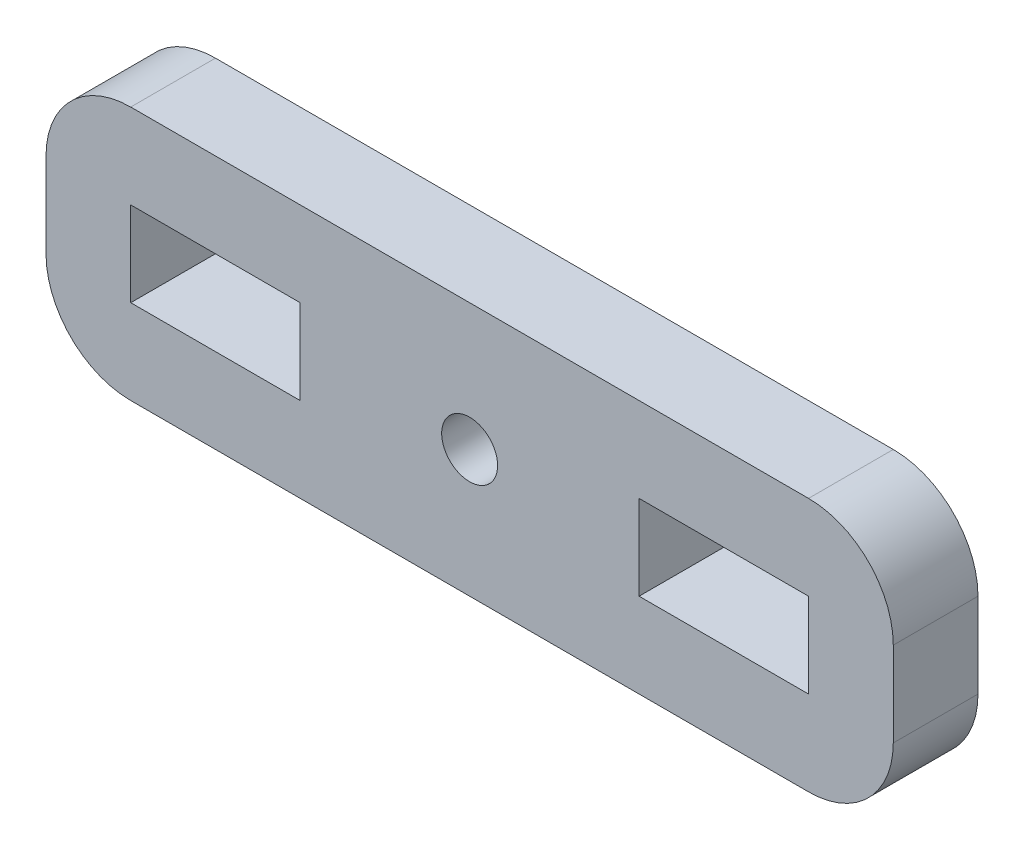
ISO-10303-21;
HEADER;
FILE_DESCRIPTION(('STEP AP214'),'2;1');
FILE_NAME('part.step','',(''),(''),'','','');
FILE_SCHEMA(('AUTOMOTIVE_DESIGN { 1 0 10303 214 1 1 1 1 }'));
ENDSEC;
DATA;
#1=APPLICATION_CONTEXT('core data for automotive mechanical design processes');
#2=APPLICATION_PROTOCOL_DEFINITION('international standard','automotive_design',2000,#1);
#3=PRODUCT_CONTEXT('',#1,'mechanical');
#4=PRODUCT('Part','Part','',(#3));
#5=PRODUCT_RELATED_PRODUCT_CATEGORY('part','',(#4));
#6=PRODUCT_DEFINITION_FORMATION('','',#4);
#7=PRODUCT_DEFINITION_CONTEXT('part definition',#1,'design');
#8=PRODUCT_DEFINITION('design','',#6,#7);
#9=PRODUCT_DEFINITION_SHAPE('','',#8);
#10=(LENGTH_UNIT() NAMED_UNIT(*) SI_UNIT(.MILLI.,.METRE.));
#11=(NAMED_UNIT(*) PLANE_ANGLE_UNIT() SI_UNIT($,.RADIAN.));
#12=(NAMED_UNIT(*) SI_UNIT($,.STERADIAN.) SOLID_ANGLE_UNIT());
#13=UNCERTAINTY_MEASURE_WITH_UNIT(LENGTH_MEASURE(1.E-05),#10,'distance_accuracy_value','');
#14=(GEOMETRIC_REPRESENTATION_CONTEXT(3) GLOBAL_UNCERTAINTY_ASSIGNED_CONTEXT((#13)) GLOBAL_UNIT_ASSIGNED_CONTEXT((#10,
#11,#12)) REPRESENTATION_CONTEXT('',''));
#15=CARTESIAN_POINT('',(0.,0.,0.));
#16=DIRECTION('',(0.,0.,1.));
#17=DIRECTION('',(1.,0.,0.));
#18=AXIS2_PLACEMENT_3D('',#15,#16,#17);
#19=CARTESIAN_POINT('',(31.75,-9.525,6.35));
#20=DIRECTION('',(-1.,0.,0.));
#21=DIRECTION('',(0.,0.,1.));
#22=AXIS2_PLACEMENT_3D('',#19,#20,#21);
#23=PLANE('',#22);
#24=DIRECTION('',(0.,1.,0.));
#25=VECTOR('',#24,1.);
#26=CARTESIAN_POINT('',(31.75,-9.525,0.));
#27=LINE('',#26,#25);
#28=CARTESIAN_POINT('',(31.75,-3.175,0.));
#29=VERTEX_POINT('',#28);
#30=CARTESIAN_POINT('',(31.75,3.175,0.));
#31=VERTEX_POINT('',#30);
#32=EDGE_CURVE('E225',#29,#31,#27,.T.);
#33=ORIENTED_EDGE('',*,*,#32,.T.);
#34=DIRECTION('',(0.,0.,-1.));
#35=VECTOR('',#34,1.);
#36=CARTESIAN_POINT('',(31.75,3.175,6.35));
#37=LINE('',#36,#35);
#38=CARTESIAN_POINT('',(31.75,3.175,6.35));
#39=VERTEX_POINT('',#38);
#40=EDGE_CURVE('E264',#31,#39,#37,.F.);
#41=ORIENTED_EDGE('',*,*,#40,.T.);
#42=DIRECTION('',(0.,1.,0.));
#43=VECTOR('',#42,1.);
#44=CARTESIAN_POINT('',(31.75,-9.525,6.35));
#45=LINE('',#44,#43);
#46=CARTESIAN_POINT('',(31.75,-3.175,6.35));
#47=VERTEX_POINT('',#46);
#48=EDGE_CURVE('E228',#47,#39,#45,.T.);
#49=ORIENTED_EDGE('',*,*,#48,.F.);
#50=DIRECTION('',(0.,0.,-1.));
#51=VECTOR('',#50,1.);
#52=CARTESIAN_POINT('',(31.75,-3.175,6.35));
#53=LINE('',#52,#51);
#54=EDGE_CURVE('E261',#47,#29,#53,.T.);
#55=ORIENTED_EDGE('',*,*,#54,.T.);
#56=EDGE_LOOP('',(#33,#41,#49,#55));
#57=FACE_BOUND('',#56,.T.);
#58=ADVANCED_FACE('F32',(#57),#23,.F.);
#59=CARTESIAN_POINT('',(-31.75,9.525,6.35));
#60=DIRECTION('',(0.,-1.,0.));
#61=DIRECTION('',(0.,0.,-1.));
#62=AXIS2_PLACEMENT_3D('',#59,#60,#61);
#63=PLANE('',#62);
#64=DIRECTION('',(-1.,0.,0.));
#65=VECTOR('',#64,1.);
#66=CARTESIAN_POINT('',(-31.75,9.525,6.35));
#67=LINE('',#66,#65);
#68=CARTESIAN_POINT('',(25.4,9.525,6.35));
#69=VERTEX_POINT('',#68);
#70=CARTESIAN_POINT('',(-25.4,9.525,6.35));
#71=VERTEX_POINT('',#70);
#72=EDGE_CURVE('E231',#69,#71,#67,.T.);
#73=ORIENTED_EDGE('',*,*,#72,.F.);
#74=DIRECTION('',(0.,0.,-1.));
#75=VECTOR('',#74,1.);
#76=CARTESIAN_POINT('',(25.4,9.525,6.35));
#77=LINE('',#76,#75);
#78=CARTESIAN_POINT('',(25.4,9.525,0.));
#79=VERTEX_POINT('',#78);
#80=EDGE_CURVE('E250',#69,#79,#77,.T.);
#81=ORIENTED_EDGE('',*,*,#80,.T.);
#82=DIRECTION('',(-1.,0.,0.));
#83=VECTOR('',#82,1.);
#84=CARTESIAN_POINT('',(-31.75,9.525,0.));
#85=LINE('',#84,#83);
#86=CARTESIAN_POINT('',(-25.4,9.525,0.));
#87=VERTEX_POINT('',#86);
#88=EDGE_CURVE('E242',#79,#87,#85,.T.);
#89=ORIENTED_EDGE('',*,*,#88,.T.);
#90=DIRECTION('',(0.,0.,-1.));
#91=VECTOR('',#90,1.);
#92=CARTESIAN_POINT('',(-25.4,9.525,6.35));
#93=LINE('',#92,#91);
#94=EDGE_CURVE('E239',#87,#71,#93,.F.);
#95=ORIENTED_EDGE('',*,*,#94,.T.);
#96=EDGE_LOOP('',(#73,#81,#89,#95));
#97=FACE_BOUND('',#96,.T.);
#98=ADVANCED_FACE('F306',(#97),#63,.F.);
#99=CARTESIAN_POINT('',(-31.75,-9.525,6.35));
#100=DIRECTION('',(1.,0.,0.));
#101=DIRECTION('',(0.,0.,-1.));
#102=AXIS2_PLACEMENT_3D('',#99,#100,#101);
#103=PLANE('',#102);
#104=DIRECTION('',(0.,-1.,0.));
#105=VECTOR('',#104,1.);
#106=CARTESIAN_POINT('',(-31.75,-9.525,6.35));
#107=LINE('',#106,#105);
#108=CARTESIAN_POINT('',(-31.75,3.175,6.35));
#109=VERTEX_POINT('',#108);
#110=CARTESIAN_POINT('',(-31.75,-3.175,6.35));
#111=VERTEX_POINT('',#110);
#112=EDGE_CURVE('E235',#109,#111,#107,.T.);
#113=ORIENTED_EDGE('',*,*,#112,.F.);
#114=DIRECTION('',(0.,0.,-1.));
#115=VECTOR('',#114,1.);
#116=CARTESIAN_POINT('',(-31.75,3.175,6.35));
#117=LINE('',#116,#115);
#118=CARTESIAN_POINT('',(-31.75,3.175,0.));
#119=VERTEX_POINT('',#118);
#120=EDGE_CURVE('E275',#109,#119,#117,.T.);
#121=ORIENTED_EDGE('',*,*,#120,.T.);
#122=DIRECTION('',(0.,-1.,0.));
#123=VECTOR('',#122,1.);
#124=CARTESIAN_POINT('',(-31.75,-9.525,0.));
#125=LINE('',#124,#123);
#126=CARTESIAN_POINT('',(-31.75,-3.175,0.));
#127=VERTEX_POINT('',#126);
#128=EDGE_CURVE('E245',#119,#127,#125,.T.);
#129=ORIENTED_EDGE('',*,*,#128,.T.);
#130=DIRECTION('',(0.,0.,-1.));
#131=VECTOR('',#130,1.);
#132=CARTESIAN_POINT('',(-31.75,-3.175,6.35));
#133=LINE('',#132,#131);
#134=EDGE_CURVE('E273',#127,#111,#133,.F.);
#135=ORIENTED_EDGE('',*,*,#134,.T.);
#136=EDGE_LOOP('',(#113,#121,#129,#135));
#137=FACE_BOUND('',#136,.T.);
#138=ADVANCED_FACE('F281',(#137),#103,.F.);
#139=CARTESIAN_POINT('',(-31.75,-9.525,6.35));
#140=DIRECTION('',(0.,1.,0.));
#141=DIRECTION('',(0.,0.,1.));
#142=AXIS2_PLACEMENT_3D('',#139,#140,#141);
#143=PLANE('',#142);
#144=DIRECTION('',(1.,0.,0.));
#145=VECTOR('',#144,1.);
#146=CARTESIAN_POINT('',(-31.75,-9.525,6.35));
#147=LINE('',#146,#145);
#148=CARTESIAN_POINT('',(-25.4,-9.525,6.35));
#149=VERTEX_POINT('',#148);
#150=CARTESIAN_POINT('',(25.4,-9.525,6.35));
#151=VERTEX_POINT('',#150);
#152=EDGE_CURVE('E237',#149,#151,#147,.T.);
#153=ORIENTED_EDGE('',*,*,#152,.F.);
#154=DIRECTION('',(0.,0.,-1.));
#155=VECTOR('',#154,1.);
#156=CARTESIAN_POINT('',(-25.4,-9.525,6.35));
#157=LINE('',#156,#155);
#158=CARTESIAN_POINT('',(-25.4,-9.525,0.));
#159=VERTEX_POINT('',#158);
#160=EDGE_CURVE('E11',#149,#159,#157,.T.);
#161=ORIENTED_EDGE('',*,*,#160,.T.);
#162=DIRECTION('',(1.,0.,0.));
#163=VECTOR('',#162,1.);
#164=CARTESIAN_POINT('',(-31.75,-9.525,0.));
#165=LINE('',#164,#163);
#166=CARTESIAN_POINT('',(25.4,-9.525,0.));
#167=VERTEX_POINT('',#166);
#168=EDGE_CURVE('E232',#159,#167,#165,.T.);
#169=ORIENTED_EDGE('',*,*,#168,.T.);
#170=DIRECTION('',(0.,0.,-1.));
#171=VECTOR('',#170,1.);
#172=CARTESIAN_POINT('',(25.4,-9.525,6.35));
#173=LINE('',#172,#171);
#174=EDGE_CURVE('E40',#167,#151,#173,.F.);
#175=ORIENTED_EDGE('',*,*,#174,.T.);
#176=EDGE_LOOP('',(#153,#161,#169,#175));
#177=FACE_BOUND('',#176,.T.);
#178=ADVANCED_FACE('F291',(#177),#143,.F.);
#179=CARTESIAN_POINT('',(0.,0.,6.35));
#180=DIRECTION('',(0.,0.,-1.));
#181=DIRECTION('',(-1.,0.,0.));
#182=AXIS2_PLACEMENT_3D('',#179,#180,#181);
#183=PLANE('',#182);
#184=DIRECTION('',(1.,0.,0.));
#185=VECTOR('',#184,1.);
#186=CARTESIAN_POINT('',(12.7,-3.175,6.35));
#187=LINE('',#186,#185);
#188=CARTESIAN_POINT('',(12.7,-3.175,6.35));
#189=VERTEX_POINT('',#188);
#190=CARTESIAN_POINT('',(25.4,-3.175,6.35));
#191=VERTEX_POINT('',#190);
#192=EDGE_CURVE('E180',#189,#191,#187,.T.);
#193=ORIENTED_EDGE('',*,*,#192,.F.);
#194=DIRECTION('',(0.,-1.,0.));
#195=VECTOR('',#194,1.);
#196=CARTESIAN_POINT('',(12.7,3.175,6.35));
#197=LINE('',#196,#195);
#198=CARTESIAN_POINT('',(12.7,3.175,6.35));
#199=VERTEX_POINT('',#198);
#200=EDGE_CURVE('E153',#199,#189,#197,.T.);
#201=ORIENTED_EDGE('',*,*,#200,.F.);
#202=DIRECTION('',(-1.,0.,0.));
#203=VECTOR('',#202,1.);
#204=CARTESIAN_POINT('',(12.7,3.175,6.35));
#205=LINE('',#204,#203);
#206=CARTESIAN_POINT('',(25.4,3.175,6.35));
#207=VERTEX_POINT('',#206);
#208=EDGE_CURVE('E171',#207,#199,#205,.T.);
#209=ORIENTED_EDGE('',*,*,#208,.F.);
#210=DIRECTION('',(0.,1.,0.));
#211=VECTOR('',#210,1.);
#212=CARTESIAN_POINT('',(25.4,3.175,6.35));
#213=LINE('',#212,#211);
#214=EDGE_CURVE('E174',#191,#207,#213,.T.);
#215=ORIENTED_EDGE('',*,*,#214,.F.);
#216=EDGE_LOOP('',(#193,#201,#209,#215));
#217=FACE_BOUND('',#216,.T.);
#218=DIRECTION('',(1.,0.,0.));
#219=VECTOR('',#218,1.);
#220=CARTESIAN_POINT('',(-25.4,-3.175,6.35));
#221=LINE('',#220,#219);
#222=CARTESIAN_POINT('',(-25.4,-3.175,6.35));
#223=VERTEX_POINT('',#222);
#224=CARTESIAN_POINT('',(-12.7,-3.175,6.35));
#225=VERTEX_POINT('',#224);
#226=EDGE_CURVE('E205',#223,#225,#221,.T.);
#227=ORIENTED_EDGE('',*,*,#226,.F.);
#228=DIRECTION('',(0.,-1.,0.));
#229=VECTOR('',#228,1.);
#230=CARTESIAN_POINT('',(-25.4,3.175,6.35));
#231=LINE('',#230,#229);
#232=CARTESIAN_POINT('',(-25.4,3.175,6.35));
#233=VERTEX_POINT('',#232);
#234=EDGE_CURVE('E186',#233,#223,#231,.T.);
#235=ORIENTED_EDGE('',*,*,#234,.F.);
#236=DIRECTION('',(-1.,0.,0.));
#237=VECTOR('',#236,1.);
#238=CARTESIAN_POINT('',(-25.4,3.175,6.35));
#239=LINE('',#238,#237);
#240=CARTESIAN_POINT('',(-12.7,3.175,6.35));
#241=VERTEX_POINT('',#240);
#242=EDGE_CURVE('E194',#241,#233,#239,.T.);
#243=ORIENTED_EDGE('',*,*,#242,.F.);
#244=DIRECTION('',(0.,1.,0.));
#245=VECTOR('',#244,1.);
#246=CARTESIAN_POINT('',(-12.7,3.175,6.35));
#247=LINE('',#246,#245);
#248=EDGE_CURVE('E208',#225,#241,#247,.T.);
#249=ORIENTED_EDGE('',*,*,#248,.F.);
#250=EDGE_LOOP('',(#227,#235,#243,#249));
#251=FACE_BOUND('',#250,.T.);
#252=CARTESIAN_POINT('',(0.,0.,6.35));
#253=DIRECTION('',(0.,0.,1.));
#254=DIRECTION('',(1.,0.,0.));
#255=AXIS2_PLACEMENT_3D('',#252,#253,#254);
#256=CIRCLE('',#255,2.0955);
#257=CARTESIAN_POINT('',(2.09550000000001,0.,6.35));
#258=VERTEX_POINT('',#257);
#259=EDGE_CURVE('E215',#258,#258,#256,.T.);
#260=ORIENTED_EDGE('',*,*,#259,.F.);
#261=EDGE_LOOP('',(#260));
#262=FACE_BOUND('',#261,.T.);
#263=ORIENTED_EDGE('',*,*,#48,.T.);
#264=CARTESIAN_POINT('',(25.4,3.175,6.35));
#265=DIRECTION('',(0.,0.,-1.));
#266=DIRECTION('',(-1.,0.,0.));
#267=AXIS2_PLACEMENT_3D('',#264,#265,#266);
#268=CIRCLE('',#267,6.35);
#269=EDGE_CURVE('E271',#39,#69,#268,.F.);
#270=ORIENTED_EDGE('',*,*,#269,.T.);
#271=ORIENTED_EDGE('',*,*,#72,.T.);
#272=CARTESIAN_POINT('',(-25.4,3.175,6.35));
#273=DIRECTION('',(0.,0.,-1.));
#274=DIRECTION('',(-1.,0.,0.));
#275=AXIS2_PLACEMENT_3D('',#272,#273,#274);
#276=CIRCLE('',#275,6.35);
#277=EDGE_CURVE('E269',#71,#109,#276,.F.);
#278=ORIENTED_EDGE('',*,*,#277,.T.);
#279=ORIENTED_EDGE('',*,*,#112,.T.);
#280=CARTESIAN_POINT('',(-25.4,-3.175,6.35));
#281=DIRECTION('',(0.,0.,-1.));
#282=DIRECTION('',(-1.,0.,0.));
#283=AXIS2_PLACEMENT_3D('',#280,#281,#282);
#284=CIRCLE('',#283,6.35);
#285=EDGE_CURVE('E53',#111,#149,#284,.F.);
#286=ORIENTED_EDGE('',*,*,#285,.T.);
#287=ORIENTED_EDGE('',*,*,#152,.T.);
#288=CARTESIAN_POINT('',(25.4,-3.175,6.35));
#289=DIRECTION('',(0.,0.,-1.));
#290=DIRECTION('',(-1.,0.,0.));
#291=AXIS2_PLACEMENT_3D('',#288,#289,#290);
#292=CIRCLE('',#291,6.35);
#293=EDGE_CURVE('E266',#151,#47,#292,.F.);
#294=ORIENTED_EDGE('',*,*,#293,.T.);
#295=EDGE_LOOP('',(#263,#270,#271,#278,#279,#286,#287,#294));
#296=FACE_BOUND('',#295,.T.);
#297=ADVANCED_FACE('F293',(#217,#251,#262,#296),#183,.F.);
#298=CARTESIAN_POINT('',(0.,0.,0.));
#299=DIRECTION('',(0.,0.,-1.));
#300=DIRECTION('',(-1.,0.,0.));
#301=AXIS2_PLACEMENT_3D('',#298,#299,#300);
#302=PLANE('',#301);
#303=DIRECTION('',(0.,-1.,0.));
#304=VECTOR('',#303,1.);
#305=CARTESIAN_POINT('',(12.7,3.175,0.));
#306=LINE('',#305,#304);
#307=CARTESIAN_POINT('',(12.7,3.175,0.));
#308=VERTEX_POINT('',#307);
#309=CARTESIAN_POINT('',(12.7,-3.175,0.));
#310=VERTEX_POINT('',#309);
#311=EDGE_CURVE('E150',#308,#310,#306,.T.);
#312=ORIENTED_EDGE('',*,*,#311,.T.);
#313=DIRECTION('',(1.,0.,0.));
#314=VECTOR('',#313,1.);
#315=CARTESIAN_POINT('',(12.7,-3.175,0.));
#316=LINE('',#315,#314);
#317=CARTESIAN_POINT('',(25.4,-3.175,0.));
#318=VERTEX_POINT('',#317);
#319=EDGE_CURVE('E162',#310,#318,#316,.T.);
#320=ORIENTED_EDGE('',*,*,#319,.T.);
#321=DIRECTION('',(0.,1.,0.));
#322=VECTOR('',#321,1.);
#323=CARTESIAN_POINT('',(25.4,3.175,0.));
#324=LINE('',#323,#322);
#325=CARTESIAN_POINT('',(25.4,3.175,0.));
#326=VERTEX_POINT('',#325);
#327=EDGE_CURVE('E166',#318,#326,#324,.T.);
#328=ORIENTED_EDGE('',*,*,#327,.T.);
#329=DIRECTION('',(-1.,0.,0.));
#330=VECTOR('',#329,1.);
#331=CARTESIAN_POINT('',(12.7,3.175,0.));
#332=LINE('',#331,#330);
#333=EDGE_CURVE('E158',#326,#308,#332,.T.);
#334=ORIENTED_EDGE('',*,*,#333,.T.);
#335=EDGE_LOOP('',(#312,#320,#328,#334));
#336=FACE_BOUND('',#335,.T.);
#337=DIRECTION('',(0.,-1.,0.));
#338=VECTOR('',#337,1.);
#339=CARTESIAN_POINT('',(-25.4,3.175,0.));
#340=LINE('',#339,#338);
#341=CARTESIAN_POINT('',(-25.4,3.175,0.));
#342=VERTEX_POINT('',#341);
#343=CARTESIAN_POINT('',(-25.4,-3.175,0.));
#344=VERTEX_POINT('',#343);
#345=EDGE_CURVE('E190',#342,#344,#340,.T.);
#346=ORIENTED_EDGE('',*,*,#345,.T.);
#347=DIRECTION('',(1.,0.,0.));
#348=VECTOR('',#347,1.);
#349=CARTESIAN_POINT('',(-25.4,-3.175,0.));
#350=LINE('',#349,#348);
#351=CARTESIAN_POINT('',(-12.7,-3.175,0.));
#352=VERTEX_POINT('',#351);
#353=EDGE_CURVE('E193',#344,#352,#350,.T.);
#354=ORIENTED_EDGE('',*,*,#353,.T.);
#355=DIRECTION('',(0.,1.,0.));
#356=VECTOR('',#355,1.);
#357=CARTESIAN_POINT('',(-12.7,3.175,0.));
#358=LINE('',#357,#356);
#359=CARTESIAN_POINT('',(-12.7,3.175,0.));
#360=VERTEX_POINT('',#359);
#361=EDGE_CURVE('E197',#352,#360,#358,.T.);
#362=ORIENTED_EDGE('',*,*,#361,.T.);
#363=DIRECTION('',(-1.,0.,0.));
#364=VECTOR('',#363,1.);
#365=CARTESIAN_POINT('',(-25.4,3.175,0.));
#366=LINE('',#365,#364);
#367=EDGE_CURVE('E200',#360,#342,#366,.T.);
#368=ORIENTED_EDGE('',*,*,#367,.T.);
#369=EDGE_LOOP('',(#346,#354,#362,#368));
#370=FACE_BOUND('',#369,.T.);
#371=CARTESIAN_POINT('',(0.,0.,0.));
#372=DIRECTION('',(0.,0.,1.));
#373=DIRECTION('',(1.,0.,0.));
#374=AXIS2_PLACEMENT_3D('',#371,#372,#373);
#375=CIRCLE('',#374,2.0955);
#376=CARTESIAN_POINT('',(2.09550000000001,0.,0.));
#377=VERTEX_POINT('',#376);
#378=EDGE_CURVE('E222',#377,#377,#375,.T.);
#379=ORIENTED_EDGE('',*,*,#378,.T.);
#380=EDGE_LOOP('',(#379));
#381=FACE_BOUND('',#380,.T.);
#382=ORIENTED_EDGE('',*,*,#88,.F.);
#383=CARTESIAN_POINT('',(25.4,3.175,0.));
#384=DIRECTION('',(0.,0.,-1.));
#385=DIRECTION('',(-1.,0.,0.));
#386=AXIS2_PLACEMENT_3D('',#383,#384,#385);
#387=CIRCLE('',#386,6.35);
#388=EDGE_CURVE('E259',#79,#31,#387,.T.);
#389=ORIENTED_EDGE('',*,*,#388,.T.);
#390=ORIENTED_EDGE('',*,*,#32,.F.);
#391=CARTESIAN_POINT('',(25.4,-3.175,0.));
#392=DIRECTION('',(0.,0.,-1.));
#393=DIRECTION('',(-1.,0.,0.));
#394=AXIS2_PLACEMENT_3D('',#391,#392,#393);
#395=CIRCLE('',#394,6.35);
#396=EDGE_CURVE('E253',#29,#167,#395,.T.);
#397=ORIENTED_EDGE('',*,*,#396,.T.);
#398=ORIENTED_EDGE('',*,*,#168,.F.);
#399=CARTESIAN_POINT('',(-25.4,-3.175,0.));
#400=DIRECTION('',(0.,0.,-1.));
#401=DIRECTION('',(-1.,0.,0.));
#402=AXIS2_PLACEMENT_3D('',#399,#400,#401);
#403=CIRCLE('',#402,6.35);
#404=EDGE_CURVE('E255',#159,#127,#403,.T.);
#405=ORIENTED_EDGE('',*,*,#404,.T.);
#406=ORIENTED_EDGE('',*,*,#128,.F.);
#407=CARTESIAN_POINT('',(-25.4,3.175,0.));
#408=DIRECTION('',(0.,0.,-1.));
#409=DIRECTION('',(-1.,0.,0.));
#410=AXIS2_PLACEMENT_3D('',#407,#408,#409);
#411=CIRCLE('',#410,6.35);
#412=EDGE_CURVE('E257',#119,#87,#411,.T.);
#413=ORIENTED_EDGE('',*,*,#412,.T.);
#414=EDGE_LOOP('',(#382,#389,#390,#397,#398,#405,#406,#413));
#415=FACE_BOUND('',#414,.T.);
#416=ADVANCED_FACE('F168',(#336,#370,#381,#415),#302,.T.);
#417=CARTESIAN_POINT('',(0.,0.,0.));
#418=DIRECTION('',(0.,0.,1.));
#419=DIRECTION('',(1.,0.,0.));
#420=AXIS2_PLACEMENT_3D('',#417,#418,#419);
#421=CYLINDRICAL_SURFACE('',#420,2.0955);
#422=ORIENTED_EDGE('',*,*,#378,.F.);
#423=EDGE_LOOP('',(#422));
#424=FACE_BOUND('',#423,.T.);
#425=ORIENTED_EDGE('',*,*,#259,.T.);
#426=EDGE_LOOP('',(#425));
#427=FACE_BOUND('',#426,.T.);
#428=ADVANCED_FACE('F329',(#424,#427),#421,.F.);
#429=CARTESIAN_POINT('',(-25.4,3.175,0.));
#430=DIRECTION('',(-1.,0.,0.));
#431=DIRECTION('',(0.,0.,1.));
#432=AXIS2_PLACEMENT_3D('',#429,#430,#431);
#433=PLANE('',#432);
#434=ORIENTED_EDGE('',*,*,#234,.T.);
#435=DIRECTION('',(0.,0.,1.));
#436=VECTOR('',#435,1.);
#437=CARTESIAN_POINT('',(-25.4,-3.175,0.));
#438=LINE('',#437,#436);
#439=EDGE_CURVE('E203',#344,#223,#438,.T.);
#440=ORIENTED_EDGE('',*,*,#439,.F.);
#441=ORIENTED_EDGE('',*,*,#345,.F.);
#442=DIRECTION('',(0.,0.,1.));
#443=VECTOR('',#442,1.);
#444=CARTESIAN_POINT('',(-25.4,3.175,0.));
#445=LINE('',#444,#443);
#446=EDGE_CURVE('E213',#342,#233,#445,.T.);
#447=ORIENTED_EDGE('',*,*,#446,.T.);
#448=EDGE_LOOP('',(#434,#440,#441,#447));
#449=FACE_BOUND('',#448,.T.);
#450=ADVANCED_FACE('F335',(#449),#433,.F.);
#451=CARTESIAN_POINT('',(-25.4,3.175,0.));
#452=DIRECTION('',(0.,1.,0.));
#453=DIRECTION('',(0.,0.,1.));
#454=AXIS2_PLACEMENT_3D('',#451,#452,#453);
#455=PLANE('',#454);
#456=ORIENTED_EDGE('',*,*,#242,.T.);
#457=ORIENTED_EDGE('',*,*,#446,.F.);
#458=ORIENTED_EDGE('',*,*,#367,.F.);
#459=DIRECTION('',(0.,0.,1.));
#460=VECTOR('',#459,1.);
#461=CARTESIAN_POINT('',(-12.7,3.175,0.));
#462=LINE('',#461,#460);
#463=EDGE_CURVE('E216',#360,#241,#462,.T.);
#464=ORIENTED_EDGE('',*,*,#463,.T.);
#465=EDGE_LOOP('',(#456,#457,#458,#464));
#466=FACE_BOUND('',#465,.T.);
#467=ADVANCED_FACE('F339',(#466),#455,.F.);
#468=CARTESIAN_POINT('',(-12.7,3.175,0.));
#469=DIRECTION('',(1.,0.,0.));
#470=DIRECTION('',(0.,1.,0.));
#471=AXIS2_PLACEMENT_3D('',#468,#469,#470);
#472=PLANE('',#471);
#473=ORIENTED_EDGE('',*,*,#248,.T.);
#474=ORIENTED_EDGE('',*,*,#463,.F.);
#475=ORIENTED_EDGE('',*,*,#361,.F.);
#476=DIRECTION('',(0.,0.,1.));
#477=VECTOR('',#476,1.);
#478=CARTESIAN_POINT('',(-12.7,-3.175,0.));
#479=LINE('',#478,#477);
#480=EDGE_CURVE('E218',#352,#225,#479,.T.);
#481=ORIENTED_EDGE('',*,*,#480,.T.);
#482=EDGE_LOOP('',(#473,#474,#475,#481));
#483=FACE_BOUND('',#482,.T.);
#484=ADVANCED_FACE('F344',(#483),#472,.F.);
#485=CARTESIAN_POINT('',(-25.4,-3.175,0.));
#486=DIRECTION('',(0.,-1.,0.));
#487=DIRECTION('',(0.,0.,-1.));
#488=AXIS2_PLACEMENT_3D('',#485,#486,#487);
#489=PLANE('',#488);
#490=ORIENTED_EDGE('',*,*,#226,.T.);
#491=ORIENTED_EDGE('',*,*,#480,.F.);
#492=ORIENTED_EDGE('',*,*,#353,.F.);
#493=ORIENTED_EDGE('',*,*,#439,.T.);
#494=EDGE_LOOP('',(#490,#491,#492,#493));
#495=FACE_BOUND('',#494,.T.);
#496=ADVANCED_FACE('F341',(#495),#489,.F.);
#497=CARTESIAN_POINT('',(12.7,3.175,0.));
#498=DIRECTION('',(-1.,0.,0.));
#499=DIRECTION('',(0.,-1.,0.));
#500=AXIS2_PLACEMENT_3D('',#497,#498,#499);
#501=PLANE('',#500);
#502=ORIENTED_EDGE('',*,*,#200,.T.);
#503=DIRECTION('',(0.,0.,1.));
#504=VECTOR('',#503,1.);
#505=CARTESIAN_POINT('',(12.7,-3.175,0.));
#506=LINE('',#505,#504);
#507=EDGE_CURVE('E146',#310,#189,#506,.T.);
#508=ORIENTED_EDGE('',*,*,#507,.F.);
#509=ORIENTED_EDGE('',*,*,#311,.F.);
#510=DIRECTION('',(0.,0.,1.));
#511=VECTOR('',#510,1.);
#512=CARTESIAN_POINT('',(12.7,3.175,0.));
#513=LINE('',#512,#511);
#514=EDGE_CURVE('E184',#308,#199,#513,.T.);
#515=ORIENTED_EDGE('',*,*,#514,.T.);
#516=EDGE_LOOP('',(#502,#508,#509,#515));
#517=FACE_BOUND('',#516,.T.);
#518=ADVANCED_FACE('F148',(#517),#501,.F.);
#519=CARTESIAN_POINT('',(12.7,3.175,0.));
#520=DIRECTION('',(0.,1.,0.));
#521=DIRECTION('',(0.,0.,1.));
#522=AXIS2_PLACEMENT_3D('',#519,#520,#521);
#523=PLANE('',#522);
#524=ORIENTED_EDGE('',*,*,#208,.T.);
#525=ORIENTED_EDGE('',*,*,#514,.F.);
#526=ORIENTED_EDGE('',*,*,#333,.F.);
#527=DIRECTION('',(0.,0.,1.));
#528=VECTOR('',#527,1.);
#529=CARTESIAN_POINT('',(25.4,3.175,0.));
#530=LINE('',#529,#528);
#531=EDGE_CURVE('E187',#326,#207,#530,.T.);
#532=ORIENTED_EDGE('',*,*,#531,.T.);
#533=EDGE_LOOP('',(#524,#525,#526,#532));
#534=FACE_BOUND('',#533,.T.);
#535=ADVANCED_FACE('F354',(#534),#523,.F.);
#536=CARTESIAN_POINT('',(25.4,3.175,0.));
#537=DIRECTION('',(1.,0.,0.));
#538=DIRECTION('',(0.,1.,0.));
#539=AXIS2_PLACEMENT_3D('',#536,#537,#538);
#540=PLANE('',#539);
#541=ORIENTED_EDGE('',*,*,#214,.T.);
#542=ORIENTED_EDGE('',*,*,#531,.F.);
#543=ORIENTED_EDGE('',*,*,#327,.F.);
#544=DIRECTION('',(0.,0.,1.));
#545=VECTOR('',#544,1.);
#546=CARTESIAN_POINT('',(25.4,-3.175,0.));
#547=LINE('',#546,#545);
#548=EDGE_CURVE('E157',#318,#191,#547,.T.);
#549=ORIENTED_EDGE('',*,*,#548,.T.);
#550=EDGE_LOOP('',(#541,#542,#543,#549));
#551=FACE_BOUND('',#550,.T.);
#552=ADVANCED_FACE('F357',(#551),#540,.F.);
#553=CARTESIAN_POINT('',(12.7,-3.175,0.));
#554=DIRECTION('',(0.,-1.,0.));
#555=DIRECTION('',(0.,0.,-1.));
#556=AXIS2_PLACEMENT_3D('',#553,#554,#555);
#557=PLANE('',#556);
#558=ORIENTED_EDGE('',*,*,#192,.T.);
#559=ORIENTED_EDGE('',*,*,#548,.F.);
#560=ORIENTED_EDGE('',*,*,#319,.F.);
#561=ORIENTED_EDGE('',*,*,#507,.T.);
#562=EDGE_LOOP('',(#558,#559,#560,#561));
#563=FACE_BOUND('',#562,.T.);
#564=ADVANCED_FACE('F163',(#563),#557,.F.);
#565=CARTESIAN_POINT('',(25.4,3.175,6.35));
#566=DIRECTION('',(0.,0.,-1.));
#567=DIRECTION('',(-1.,0.,0.));
#568=AXIS2_PLACEMENT_3D('',#565,#566,#567);
#569=CYLINDRICAL_SURFACE('',#568,6.35);
#570=ORIENTED_EDGE('',*,*,#269,.F.);
#571=ORIENTED_EDGE('',*,*,#40,.F.);
#572=ORIENTED_EDGE('',*,*,#388,.F.);
#573=ORIENTED_EDGE('',*,*,#80,.F.);
#574=EDGE_LOOP('',(#570,#571,#572,#573));
#575=FACE_BOUND('',#574,.T.);
#576=ADVANCED_FACE('F303',(#575),#569,.T.);
#577=CARTESIAN_POINT('',(-25.4,3.175,6.35));
#578=DIRECTION('',(0.,0.,-1.));
#579=DIRECTION('',(-1.,0.,0.));
#580=AXIS2_PLACEMENT_3D('',#577,#578,#579);
#581=CYLINDRICAL_SURFACE('',#580,6.35);
#582=ORIENTED_EDGE('',*,*,#277,.F.);
#583=ORIENTED_EDGE('',*,*,#94,.F.);
#584=ORIENTED_EDGE('',*,*,#412,.F.);
#585=ORIENTED_EDGE('',*,*,#120,.F.);
#586=EDGE_LOOP('',(#582,#583,#584,#585));
#587=FACE_BOUND('',#586,.T.);
#588=ADVANCED_FACE('F308',(#587),#581,.T.);
#589=CARTESIAN_POINT('',(-25.4,-3.175,6.35));
#590=DIRECTION('',(0.,0.,-1.));
#591=DIRECTION('',(-1.,0.,0.));
#592=AXIS2_PLACEMENT_3D('',#589,#590,#591);
#593=CYLINDRICAL_SURFACE('',#592,6.35);
#594=ORIENTED_EDGE('',*,*,#285,.F.);
#595=ORIENTED_EDGE('',*,*,#134,.F.);
#596=ORIENTED_EDGE('',*,*,#404,.F.);
#597=ORIENTED_EDGE('',*,*,#160,.F.);
#598=EDGE_LOOP('',(#594,#595,#596,#597));
#599=FACE_BOUND('',#598,.T.);
#600=ADVANCED_FACE('F290',(#599),#593,.T.);
#601=CARTESIAN_POINT('',(25.4,-3.175,6.35));
#602=DIRECTION('',(0.,0.,-1.));
#603=DIRECTION('',(-1.,0.,0.));
#604=AXIS2_PLACEMENT_3D('',#601,#602,#603);
#605=CYLINDRICAL_SURFACE('',#604,6.35);
#606=ORIENTED_EDGE('',*,*,#293,.F.);
#607=ORIENTED_EDGE('',*,*,#174,.F.);
#608=ORIENTED_EDGE('',*,*,#396,.F.);
#609=ORIENTED_EDGE('',*,*,#54,.F.);
#610=EDGE_LOOP('',(#606,#607,#608,#609));
#611=FACE_BOUND('',#610,.T.);
#612=ADVANCED_FACE('F34',(#611),#605,.T.);
#613=CLOSED_SHELL('',(#58,#98,#138,#178,#297,#416,#428,#450,#467,#484,#496,#518,#535,#552,#564,
#576,#588,#600,#612));
#614=MANIFOLD_SOLID_BREP('B2',#613);
#615=ADVANCED_BREP_SHAPE_REPRESENTATION('',(#18,#614),#14);
#616=SHAPE_DEFINITION_REPRESENTATION(#9,#615);
ENDSEC;
END-ISO-10303-21;
